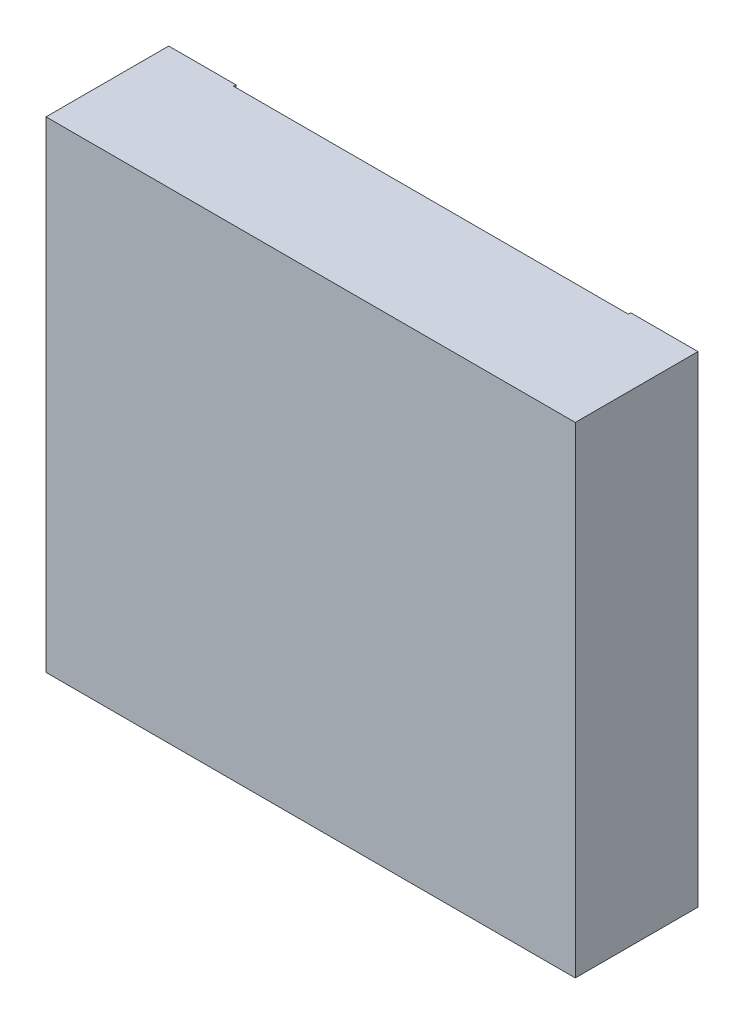
ISO-10303-21;
HEADER;
FILE_DESCRIPTION(('STEP AP214'),'2;1');
FILE_NAME('part.step','',(''),(''),'','','');
FILE_SCHEMA(('AUTOMOTIVE_DESIGN { 1 0 10303 214 1 1 1 1 }'));
ENDSEC;
DATA;
#1=APPLICATION_CONTEXT('core data for automotive mechanical design processes');
#2=APPLICATION_PROTOCOL_DEFINITION('international standard','automotive_design',2000,#1);
#3=PRODUCT_CONTEXT('',#1,'mechanical');
#4=PRODUCT('Part','Part','',(#3));
#5=PRODUCT_RELATED_PRODUCT_CATEGORY('part','',(#4));
#6=PRODUCT_DEFINITION_FORMATION('','',#4);
#7=PRODUCT_DEFINITION_CONTEXT('part definition',#1,'design');
#8=PRODUCT_DEFINITION('design','',#6,#7);
#9=PRODUCT_DEFINITION_SHAPE('','',#8);
#10=(LENGTH_UNIT() NAMED_UNIT(*) SI_UNIT(.MILLI.,.METRE.));
#11=(NAMED_UNIT(*) PLANE_ANGLE_UNIT() SI_UNIT($,.RADIAN.));
#12=(NAMED_UNIT(*) SI_UNIT($,.STERADIAN.) SOLID_ANGLE_UNIT());
#13=UNCERTAINTY_MEASURE_WITH_UNIT(LENGTH_MEASURE(1.E-05),#10,'distance_accuracy_value','');
#14=(GEOMETRIC_REPRESENTATION_CONTEXT(3) GLOBAL_UNCERTAINTY_ASSIGNED_CONTEXT((#13)) GLOBAL_UNIT_ASSIGNED_CONTEXT((#10,
#11,#12)) REPRESENTATION_CONTEXT('',''));
#15=CARTESIAN_POINT('',(0.,0.,0.));
#16=DIRECTION('',(0.,0.,1.));
#17=DIRECTION('',(1.,0.,0.));
#18=AXIS2_PLACEMENT_3D('',#15,#16,#17);
#19=CARTESIAN_POINT('',(0.,0.,0.00499999987368938));
#20=DIRECTION('',(0.,0.,-1.));
#21=DIRECTION('',(-1.,0.,0.));
#22=AXIS2_PLACEMENT_3D('',#19,#20,#21);
#23=PLANE('',#22);
#24=DIRECTION('',(-1.,0.,0.));
#25=VECTOR('',#24,1.);
#26=CARTESIAN_POINT('',(-0.820599962025881,1.00000004749745,0.00499999987368938));
#27=LINE('',#26,#25);
#28=CARTESIAN_POINT('',(-0.820599962025881,1.00000004749745,0.00499999987368938));
#29=VERTEX_POINT('',#28);
#30=CARTESIAN_POINT('',(-1.09999999403954,1.00000004749745,0.00499999987368938));
#31=VERTEX_POINT('',#30);
#32=EDGE_CURVE('E108',#29,#31,#27,.T.);
#33=ORIENTED_EDGE('',*,*,#32,.F.);
#34=DIRECTION('',(0.,1.,0.));
#35=VECTOR('',#34,1.);
#36=CARTESIAN_POINT('',(-0.820599962025881,-1.00000004749745,0.00499999987368938));
#37=LINE('',#36,#35);
#38=CARTESIAN_POINT('',(-0.820599962025881,-1.00000004749745,0.00499999987368938));
#39=VERTEX_POINT('',#38);
#40=EDGE_CURVE('E101',#39,#29,#37,.T.);
#41=ORIENTED_EDGE('',*,*,#40,.F.);
#42=DIRECTION('',(1.,0.,0.));
#43=VECTOR('',#42,1.);
#44=CARTESIAN_POINT('',(-1.09999999403954,-1.00000004749745,0.00499999987368938));
#45=LINE('',#44,#43);
#46=CARTESIAN_POINT('',(-1.09999999403954,-1.00000004749745,0.00499999987368938));
#47=VERTEX_POINT('',#46);
#48=EDGE_CURVE('E88',#47,#39,#45,.T.);
#49=ORIENTED_EDGE('',*,*,#48,.F.);
#50=DIRECTION('',(0.,-1.,0.));
#51=VECTOR('',#50,1.);
#52=CARTESIAN_POINT('',(-1.09999999403954,1.00000004749745,0.00499999987368938));
#53=LINE('',#52,#51);
#54=EDGE_CURVE('E19',#31,#47,#53,.T.);
#55=ORIENTED_EDGE('',*,*,#54,.F.);
#56=EDGE_LOOP('',(#33,#41,#49,#55));
#57=FACE_BOUND('',#56,.T.);
#58=ADVANCED_FACE('F16',(#57),#23,.T.);
#59=CARTESIAN_POINT('',(0.,0.,0.00499999987368938));
#60=DIRECTION('',(0.,0.,-1.));
#61=DIRECTION('',(-1.,0.,0.));
#62=AXIS2_PLACEMENT_3D('',#59,#60,#61);
#63=PLANE('',#62);
#64=DIRECTION('',(1.,0.,0.));
#65=VECTOR('',#64,1.);
#66=CARTESIAN_POINT('',(0.820599962025881,-1.00000004749745,0.00499999987368938));
#67=LINE('',#66,#65);
#68=CARTESIAN_POINT('',(0.820599962025881,-1.00000004749745,0.00499999987368938));
#69=VERTEX_POINT('',#68);
#70=CARTESIAN_POINT('',(1.09999999403954,-1.00000004749745,0.00499999987368938));
#71=VERTEX_POINT('',#70);
#72=EDGE_CURVE('E103',#69,#71,#67,.T.);
#73=ORIENTED_EDGE('',*,*,#72,.F.);
#74=DIRECTION('',(0.,-1.,0.));
#75=VECTOR('',#74,1.);
#76=CARTESIAN_POINT('',(0.820599962025881,1.00000004749745,0.00499999987368938));
#77=LINE('',#76,#75);
#78=CARTESIAN_POINT('',(0.820599962025881,1.00000004749745,0.00499999987368938));
#79=VERTEX_POINT('',#78);
#80=EDGE_CURVE('E118',#79,#69,#77,.T.);
#81=ORIENTED_EDGE('',*,*,#80,.F.);
#82=DIRECTION('',(-1.,0.,0.));
#83=VECTOR('',#82,1.);
#84=CARTESIAN_POINT('',(1.09999999403954,1.00000004749745,0.00499999987368938));
#85=LINE('',#84,#83);
#86=CARTESIAN_POINT('',(1.09999999403954,1.00000004749745,0.00499999987368938));
#87=VERTEX_POINT('',#86);
#88=EDGE_CURVE('E110',#87,#79,#85,.T.);
#89=ORIENTED_EDGE('',*,*,#88,.F.);
#90=DIRECTION('',(0.,1.,0.));
#91=VECTOR('',#90,1.);
#92=CARTESIAN_POINT('',(1.09999999403954,-1.00000004749745,0.00499999987368938));
#93=LINE('',#92,#91);
#94=EDGE_CURVE('E104',#71,#87,#93,.T.);
#95=ORIENTED_EDGE('',*,*,#94,.F.);
#96=EDGE_LOOP('',(#73,#81,#89,#95));
#97=FACE_BOUND('',#96,.T.);
#98=ADVANCED_FACE('F162',(#97),#63,.T.);
#99=CARTESIAN_POINT('',(-0.820599962025881,0.,0.));
#100=DIRECTION('',(1.,0.,0.));
#101=DIRECTION('',(0.,0.,-1.));
#102=AXIS2_PLACEMENT_3D('',#99,#100,#101);
#103=PLANE('',#102);
#104=DIRECTION('',(0.,1.,0.));
#105=VECTOR('',#104,1.);
#106=CARTESIAN_POINT('',(-0.820599962025881,-1.00000004749745,0.0149999996210681));
#107=LINE('',#106,#105);
#108=CARTESIAN_POINT('',(-0.820599962025881,-1.00000004749745,0.0149999996210681));
#109=VERTEX_POINT('',#108);
#110=CARTESIAN_POINT('',(-0.820599962025881,1.00000004749745,0.0149999996210681));
#111=VERTEX_POINT('',#110);
#112=EDGE_CURVE('E127',#109,#111,#107,.T.);
#113=ORIENTED_EDGE('',*,*,#112,.F.);
#114=DIRECTION('',(0.,0.,-1.));
#115=VECTOR('',#114,1.);
#116=CARTESIAN_POINT('',(-0.820599962025881,-1.00000004749745,0.0149999996210681));
#117=LINE('',#116,#115);
#118=EDGE_CURVE('E112',#109,#39,#117,.T.);
#119=ORIENTED_EDGE('',*,*,#118,.T.);
#120=ORIENTED_EDGE('',*,*,#40,.T.);
#121=DIRECTION('',(0.,0.,1.));
#122=VECTOR('',#121,1.);
#123=CARTESIAN_POINT('',(-0.820599962025881,1.00000004749745,0.00499999987368938));
#124=LINE('',#123,#122);
#125=EDGE_CURVE('E34',#29,#111,#124,.T.);
#126=ORIENTED_EDGE('',*,*,#125,.T.);
#127=EDGE_LOOP('',(#113,#119,#120,#126));
#128=FACE_BOUND('',#127,.T.);
#129=ADVANCED_FACE('F154',(#128),#103,.T.);
#130=CARTESIAN_POINT('',(0.820599962025881,0.,0.));
#131=DIRECTION('',(-1.,0.,0.));
#132=DIRECTION('',(0.,0.,1.));
#133=AXIS2_PLACEMENT_3D('',#130,#131,#132);
#134=PLANE('',#133);
#135=DIRECTION('',(0.,-1.,0.));
#136=VECTOR('',#135,1.);
#137=CARTESIAN_POINT('',(0.820599962025881,1.00000004749745,0.0149999996210681));
#138=LINE('',#137,#136);
#139=CARTESIAN_POINT('',(0.820599962025881,1.00000004749745,0.0149999996210681));
#140=VERTEX_POINT('',#139);
#141=CARTESIAN_POINT('',(0.820599962025881,-1.00000004749745,0.0149999996210681));
#142=VERTEX_POINT('',#141);
#143=EDGE_CURVE('E128',#140,#142,#138,.T.);
#144=ORIENTED_EDGE('',*,*,#143,.F.);
#145=DIRECTION('',(0.,0.,-1.));
#146=VECTOR('',#145,1.);
#147=CARTESIAN_POINT('',(0.820599962025881,1.00000004749745,0.0149999996210681));
#148=LINE('',#147,#146);
#149=EDGE_CURVE('E114',#140,#79,#148,.T.);
#150=ORIENTED_EDGE('',*,*,#149,.T.);
#151=ORIENTED_EDGE('',*,*,#80,.T.);
#152=DIRECTION('',(0.,0.,1.));
#153=VECTOR('',#152,1.);
#154=CARTESIAN_POINT('',(0.820599962025881,-1.00000004749745,0.00499999987368938));
#155=LINE('',#154,#153);
#156=EDGE_CURVE('E93',#69,#142,#155,.T.);
#157=ORIENTED_EDGE('',*,*,#156,.T.);
#158=EDGE_LOOP('',(#144,#150,#151,#157));
#159=FACE_BOUND('',#158,.T.);
#160=ADVANCED_FACE('F160',(#159),#134,.T.);
#161=CARTESIAN_POINT('',(-1.09999999403954,0.,0.));
#162=DIRECTION('',(-1.,0.,0.));
#163=DIRECTION('',(0.,0.,1.));
#164=AXIS2_PLACEMENT_3D('',#161,#162,#163);
#165=PLANE('',#164);
#166=DIRECTION('',(0.,0.,-1.));
#167=VECTOR('',#166,1.);
#168=CARTESIAN_POINT('',(-1.09999999403954,-1.00000004749745,0.514999963343143));
#169=LINE('',#168,#167);
#170=CARTESIAN_POINT('',(-1.09999999403954,-1.00000004749745,0.514999963343143));
#171=VERTEX_POINT('',#170);
#172=EDGE_CURVE('E84',#171,#47,#169,.T.);
#173=ORIENTED_EDGE('',*,*,#172,.F.);
#174=DIRECTION('',(0.,-1.,0.));
#175=VECTOR('',#174,1.);
#176=CARTESIAN_POINT('',(-1.09999999403954,1.00000004749745,0.514999963343143));
#177=LINE('',#176,#175);
#178=CARTESIAN_POINT('',(-1.09999999403954,1.00000004749745,0.514999963343143));
#179=VERTEX_POINT('',#178);
#180=EDGE_CURVE('E131',#179,#171,#177,.T.);
#181=ORIENTED_EDGE('',*,*,#180,.F.);
#182=DIRECTION('',(0.,0.,1.));
#183=VECTOR('',#182,1.);
#184=CARTESIAN_POINT('',(-1.09999999403954,1.00000004749745,0.0149999996210681));
#185=LINE('',#184,#183);
#186=EDGE_CURVE('E98',#31,#179,#185,.T.);
#187=ORIENTED_EDGE('',*,*,#186,.F.);
#188=ORIENTED_EDGE('',*,*,#54,.T.);
#189=EDGE_LOOP('',(#173,#181,#187,#188));
#190=FACE_BOUND('',#189,.T.);
#191=ADVANCED_FACE('F96',(#190),#165,.T.);
#192=CARTESIAN_POINT('',(1.09999999403954,0.,0.));
#193=DIRECTION('',(1.,0.,0.));
#194=DIRECTION('',(0.,0.,-1.));
#195=AXIS2_PLACEMENT_3D('',#192,#193,#194);
#196=PLANE('',#195);
#197=DIRECTION('',(0.,0.,-1.));
#198=VECTOR('',#197,1.);
#199=CARTESIAN_POINT('',(1.09999999403954,1.00000004749745,0.514999963343143));
#200=LINE('',#199,#198);
#201=CARTESIAN_POINT('',(1.09999999403954,1.00000004749745,0.514999963343143));
#202=VERTEX_POINT('',#201);
#203=EDGE_CURVE('E125',#202,#87,#200,.T.);
#204=ORIENTED_EDGE('',*,*,#203,.F.);
#205=DIRECTION('',(0.,1.,0.));
#206=VECTOR('',#205,1.);
#207=CARTESIAN_POINT('',(1.09999999403954,-1.00000004749745,0.514999963343143));
#208=LINE('',#207,#206);
#209=CARTESIAN_POINT('',(1.09999999403954,-1.00000004749745,0.514999963343143));
#210=VERTEX_POINT('',#209);
#211=EDGE_CURVE('E137',#210,#202,#208,.T.);
#212=ORIENTED_EDGE('',*,*,#211,.F.);
#213=DIRECTION('',(0.,0.,-1.));
#214=VECTOR('',#213,1.);
#215=CARTESIAN_POINT('',(1.09999999403954,-1.00000004749745,0.514999963343143));
#216=LINE('',#215,#214);
#217=EDGE_CURVE('E79',#210,#71,#216,.T.);
#218=ORIENTED_EDGE('',*,*,#217,.T.);
#219=ORIENTED_EDGE('',*,*,#94,.T.);
#220=EDGE_LOOP('',(#204,#212,#218,#219));
#221=FACE_BOUND('',#220,.T.);
#222=ADVANCED_FACE('F148',(#221),#196,.T.);
#223=CARTESIAN_POINT('',(0.,0.,0.0149999996210681));
#224=DIRECTION('',(0.,0.,-1.));
#225=DIRECTION('',(-1.,0.,0.));
#226=AXIS2_PLACEMENT_3D('',#223,#224,#225);
#227=PLANE('',#226);
#228=DIRECTION('',(1.,0.,0.));
#229=VECTOR('',#228,1.);
#230=CARTESIAN_POINT('',(-0.820599962025881,-1.00000004749745,0.0149999996210681));
#231=LINE('',#230,#229);
#232=EDGE_CURVE('E134',#109,#142,#231,.T.);
#233=ORIENTED_EDGE('',*,*,#232,.F.);
#234=ORIENTED_EDGE('',*,*,#112,.T.);
#235=DIRECTION('',(-1.,0.,0.));
#236=VECTOR('',#235,1.);
#237=CARTESIAN_POINT('',(0.820599962025881,1.00000004749745,0.0149999996210681));
#238=LINE('',#237,#236);
#239=EDGE_CURVE('E140',#140,#111,#238,.T.);
#240=ORIENTED_EDGE('',*,*,#239,.F.);
#241=ORIENTED_EDGE('',*,*,#143,.T.);
#242=EDGE_LOOP('',(#233,#234,#240,#241));
#243=FACE_BOUND('',#242,.T.);
#244=ADVANCED_FACE('F157',(#243),#227,.T.);
#245=CARTESIAN_POINT('',(0.,-1.00000004749745,0.));
#246=DIRECTION('',(0.,-1.,0.));
#247=DIRECTION('',(0.,0.,-1.));
#248=AXIS2_PLACEMENT_3D('',#245,#246,#247);
#249=PLANE('',#248);
#250=DIRECTION('',(1.,0.,0.));
#251=VECTOR('',#250,1.);
#252=CARTESIAN_POINT('',(-0.820599962025881,-1.00000004749745,0.514999963343143));
#253=LINE('',#252,#251);
#254=EDGE_CURVE('E25',#171,#210,#253,.T.);
#255=ORIENTED_EDGE('',*,*,#254,.F.);
#256=ORIENTED_EDGE('',*,*,#172,.T.);
#257=ORIENTED_EDGE('',*,*,#48,.T.);
#258=ORIENTED_EDGE('',*,*,#118,.F.);
#259=ORIENTED_EDGE('',*,*,#232,.T.);
#260=ORIENTED_EDGE('',*,*,#156,.F.);
#261=ORIENTED_EDGE('',*,*,#72,.T.);
#262=ORIENTED_EDGE('',*,*,#217,.F.);
#263=EDGE_LOOP('',(#255,#256,#257,#258,#259,#260,#261,#262));
#264=FACE_BOUND('',#263,.T.);
#265=ADVANCED_FACE('F86',(#264),#249,.T.);
#266=CARTESIAN_POINT('',(0.,1.00000004749745,0.));
#267=DIRECTION('',(0.,1.,0.));
#268=DIRECTION('',(0.,0.,1.));
#269=AXIS2_PLACEMENT_3D('',#266,#267,#268);
#270=PLANE('',#269);
#271=ORIENTED_EDGE('',*,*,#239,.T.);
#272=ORIENTED_EDGE('',*,*,#125,.F.);
#273=ORIENTED_EDGE('',*,*,#32,.T.);
#274=ORIENTED_EDGE('',*,*,#186,.T.);
#275=DIRECTION('',(-1.,0.,0.));
#276=VECTOR('',#275,1.);
#277=CARTESIAN_POINT('',(0.820599962025881,1.00000004749745,0.514999963343143));
#278=LINE('',#277,#276);
#279=EDGE_CURVE('E10',#202,#179,#278,.T.);
#280=ORIENTED_EDGE('',*,*,#279,.F.);
#281=ORIENTED_EDGE('',*,*,#203,.T.);
#282=ORIENTED_EDGE('',*,*,#88,.T.);
#283=ORIENTED_EDGE('',*,*,#149,.F.);
#284=EDGE_LOOP('',(#271,#272,#273,#274,#280,#281,#282,#283));
#285=FACE_BOUND('',#284,.T.);
#286=ADVANCED_FACE('F151',(#285),#270,.T.);
#287=CARTESIAN_POINT('',(0.,0.,0.514999963343143));
#288=DIRECTION('',(0.,0.,1.));
#289=DIRECTION('',(1.,0.,0.));
#290=AXIS2_PLACEMENT_3D('',#287,#288,#289);
#291=PLANE('',#290);
#292=ORIENTED_EDGE('',*,*,#279,.T.);
#293=ORIENTED_EDGE('',*,*,#180,.T.);
#294=ORIENTED_EDGE('',*,*,#254,.T.);
#295=ORIENTED_EDGE('',*,*,#211,.T.);
#296=EDGE_LOOP('',(#292,#293,#294,#295));
#297=FACE_BOUND('',#296,.T.);
#298=ADVANCED_FACE('F144',(#297),#291,.T.);
#299=CLOSED_SHELL('',(#58,#98,#129,#160,#191,#222,#244,#265,#286,#298));
#300=MANIFOLD_SOLID_BREP('B1',#299);
#301=ADVANCED_BREP_SHAPE_REPRESENTATION('',(#18,#300),#14);
#302=SHAPE_DEFINITION_REPRESENTATION(#9,#301);
ENDSEC;
END-ISO-10303-21;
